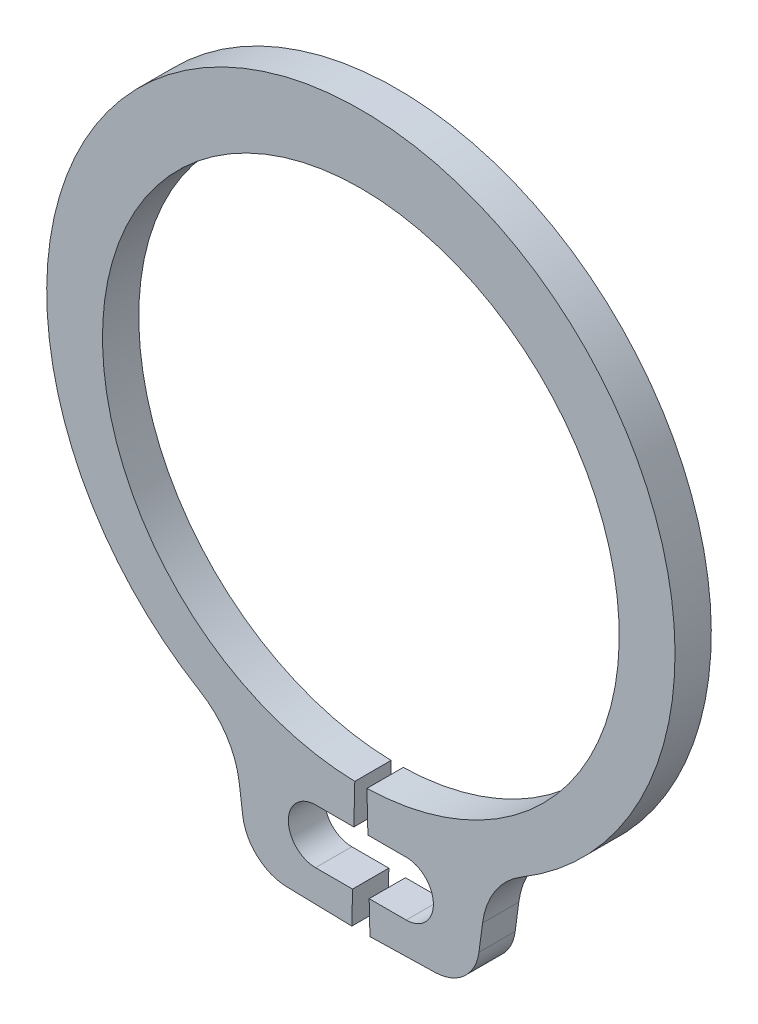
ISO-10303-21;
HEADER;
FILE_DESCRIPTION(('STEP AP214'),'2;1');
FILE_NAME('part.step','',(''),(''),'','','');
FILE_SCHEMA(('AUTOMOTIVE_DESIGN { 1 0 10303 214 1 1 1 1 }'));
ENDSEC;
DATA;
#1=APPLICATION_CONTEXT('core data for automotive mechanical design processes');
#2=APPLICATION_PROTOCOL_DEFINITION('international standard','automotive_design',2000,#1);
#3=PRODUCT_CONTEXT('',#1,'mechanical');
#4=PRODUCT('Part','Part','',(#3));
#5=PRODUCT_RELATED_PRODUCT_CATEGORY('part','',(#4));
#6=PRODUCT_DEFINITION_FORMATION('','',#4);
#7=PRODUCT_DEFINITION_CONTEXT('part definition',#1,'design');
#8=PRODUCT_DEFINITION('design','',#6,#7);
#9=PRODUCT_DEFINITION_SHAPE('','',#8);
#10=(LENGTH_UNIT() NAMED_UNIT(*) SI_UNIT(.MILLI.,.METRE.));
#11=(NAMED_UNIT(*) PLANE_ANGLE_UNIT() SI_UNIT($,.RADIAN.));
#12=(NAMED_UNIT(*) SI_UNIT($,.STERADIAN.) SOLID_ANGLE_UNIT());
#13=UNCERTAINTY_MEASURE_WITH_UNIT(LENGTH_MEASURE(1.E-05),#10,'distance_accuracy_value','');
#14=(GEOMETRIC_REPRESENTATION_CONTEXT(3) GLOBAL_UNCERTAINTY_ASSIGNED_CONTEXT((#13)) GLOBAL_UNIT_ASSIGNED_CONTEXT((#10,
#11,#12)) REPRESENTATION_CONTEXT('',''));
#15=CARTESIAN_POINT('',(0.,0.,0.));
#16=DIRECTION('',(0.,0.,1.));
#17=DIRECTION('',(1.,0.,0.));
#18=AXIS2_PLACEMENT_3D('',#15,#16,#17);
#19=CARTESIAN_POINT('',(0.,0.,0.));
#20=DIRECTION('',(0.,0.,1.));
#21=DIRECTION('',(1.,0.,0.));
#22=AXIS2_PLACEMENT_3D('',#19,#20,#21);
#23=PLANE('',#22);
#24=CARTESIAN_POINT('',(0.,0.,0.));
#25=DIRECTION('',(0.,0.,1.));
#26=DIRECTION('',(1.,0.,0.));
#27=AXIS2_PLACEMENT_3D('',#24,#25,#26);
#28=CIRCLE('',#27,2.85);
#29=CARTESIAN_POINT('',(-0.0670588235294138,-2.84921096344003,0.));
#30=VERTEX_POINT('',#29);
#31=CARTESIAN_POINT('',(0.0670588235294131,-2.84921096344003,0.));
#32=VERTEX_POINT('',#31);
#33=EDGE_CURVE('E169',#30,#32,#28,.F.);
#34=ORIENTED_EDGE('',*,*,#33,.T.);
#35=DIRECTION('',(0.0235294117647061,-0.999723145066676,0.));
#36=VECTOR('',#35,1.);
#37=CARTESIAN_POINT('',(0.0670588235294131,-2.84921096344003,0.));
#38=LINE('',#37,#36);
#39=CARTESIAN_POINT('',(0.0774414789751765,-3.29035165408627,0.));
#40=VERTEX_POINT('',#39);
#41=EDGE_CURVE('E145',#32,#40,#38,.T.);
#42=ORIENTED_EDGE('',*,*,#41,.T.);
#43=DIRECTION('',(1.,0.,0.));
#44=VECTOR('',#43,1.);
#45=CARTESIAN_POINT('',(0.,-3.29035165408627,0.));
#46=LINE('',#45,#44);
#47=CARTESIAN_POINT('',(0.5,-3.29035165408627,0.));
#48=VERTEX_POINT('',#47);
#49=EDGE_CURVE('E150',#40,#48,#46,.T.);
#50=ORIENTED_EDGE('',*,*,#49,.T.);
#51=CARTESIAN_POINT('',(0.5,-3.59035165408627,0.));
#52=DIRECTION('',(0.,0.,1.));
#53=DIRECTION('',(1.,0.,0.));
#54=AXIS2_PLACEMENT_3D('',#51,#52,#53);
#55=CIRCLE('',#54,0.3);
#56=CARTESIAN_POINT('',(0.499999999999987,-3.89035165408627,0.));
#57=VERTEX_POINT('',#56);
#58=EDGE_CURVE('E19',#48,#57,#55,.F.);
#59=ORIENTED_EDGE('',*,*,#58,.T.);
#60=DIRECTION('',(1.,0.,0.));
#61=VECTOR('',#60,1.);
#62=CARTESIAN_POINT('',(0.499999999999973,-3.89035165408627,0.));
#63=LINE('',#62,#61);
#64=CARTESIAN_POINT('',(0.0915630356566403,-3.89035165408627,0.));
#65=VERTEX_POINT('',#64);
#66=EDGE_CURVE('E244',#57,#65,#63,.F.);
#67=ORIENTED_EDGE('',*,*,#66,.T.);
#68=DIRECTION('',(0.0235294117647059,-0.999723145066676,0.));
#69=VECTOR('',#68,1.);
#70=CARTESIAN_POINT('',(0.0670588235294131,-2.84921096344003,0.));
#71=LINE('',#70,#69);
#72=CARTESIAN_POINT('',(0.100000000000002,-4.24882336653338,0.));
#73=VERTEX_POINT('',#72);
#74=EDGE_CURVE('E243',#73,#65,#71,.F.);
#75=ORIENTED_EDGE('',*,*,#74,.F.);
#76=DIRECTION('',(0.999723145066676,0.0235294117647064,0.));
#77=VECTOR('',#76,1.);
#78=CARTESIAN_POINT('',(0.100000000000003,-4.24882336653338,0.));
#79=LINE('',#78,#77);
#80=CARTESIAN_POINT('',(0.818532180224087,-4.2319120450159,0.));
#81=VERTEX_POINT('',#80);
#82=EDGE_CURVE('E234',#81,#73,#79,.F.);
#83=ORIENTED_EDGE('',*,*,#82,.F.);
#84=CARTESIAN_POINT('',(0.806767474341746,-3.73205047248256,0.));
#85=DIRECTION('',(0.,0.,1.));
#86=DIRECTION('',(1.,0.,0.));
#87=AXIS2_PLACEMENT_3D('',#84,#85,#86);
#88=CIRCLE('',#87,0.499999999999999);
#89=CARTESIAN_POINT('',(1.30248990502863,-3.79731356859259,0.));
#90=VERTEX_POINT('',#89);
#91=EDGE_CURVE('E231',#90,#81,#88,.F.);
#92=ORIENTED_EDGE('',*,*,#91,.F.);
#93=DIRECTION('',(0.130526192220054,0.99144486137381,0.));
#94=VECTOR('',#93,1.);
#95=CARTESIAN_POINT('',(1.34189484626025,-3.49800332417078,0.));
#96=LINE('',#95,#94);
#97=CARTESIAN_POINT('',(1.34189484626025,-3.49800332417078,0.));
#98=VERTEX_POINT('',#97);
#99=EDGE_CURVE('E228',#98,#90,#96,.F.);
#100=ORIENTED_EDGE('',*,*,#99,.F.);
#101=CARTESIAN_POINT('',(2.23404735245542,-3.61545742984023,0.));
#102=DIRECTION('',(0.,0.,1.));
#103=DIRECTION('',(1.,0.,0.));
#104=AXIS2_PLACEMENT_3D('',#101,#102,#103);
#105=CIRCLE('',#104,0.899850855002616);
#106=CARTESIAN_POINT('',(1.77351197353993,-2.84238645896103,0.));
#107=VERTEX_POINT('',#106);
#108=EDGE_CURVE('E222',#98,#107,#105,.F.);
#109=ORIENTED_EDGE('',*,*,#108,.T.);
#110=CARTESIAN_POINT('',(0.,0.134693448513281,0.));
#111=DIRECTION('',(0.,0.,1.));
#112=DIRECTION('',(1.,0.,0.));
#113=AXIS2_PLACEMENT_3D('',#110,#111,#112);
#114=CIRCLE('',#113,3.46530655148672);
#115=CARTESIAN_POINT('',(-1.77351197353993,-2.84238645896103,0.));
#116=VERTEX_POINT('',#115);
#117=EDGE_CURVE('E219',#116,#107,#114,.F.);
#118=ORIENTED_EDGE('',*,*,#117,.F.);
#119=CARTESIAN_POINT('',(-2.23404735245541,-3.61545742984023,0.));
#120=DIRECTION('',(0.,0.,1.));
#121=DIRECTION('',(1.,0.,0.));
#122=AXIS2_PLACEMENT_3D('',#119,#120,#121);
#123=CIRCLE('',#122,0.899850855002616);
#124=CARTESIAN_POINT('',(-1.3418948462602,-3.49800332417078,0.));
#125=VERTEX_POINT('',#124);
#126=EDGE_CURVE('E218',#116,#125,#123,.F.);
#127=ORIENTED_EDGE('',*,*,#126,.T.);
#128=DIRECTION('',(0.130526192220054,-0.99144486137381,0.));
#129=VECTOR('',#128,1.);
#130=CARTESIAN_POINT('',(-1.3418948462602,-3.49800332417078,0.));
#131=LINE('',#130,#129);
#132=CARTESIAN_POINT('',(-1.3024899050286,-3.79731356859259,0.));
#133=VERTEX_POINT('',#132);
#134=EDGE_CURVE('E214',#133,#125,#131,.F.);
#135=ORIENTED_EDGE('',*,*,#134,.F.);
#136=CARTESIAN_POINT('',(-0.806767474341718,-3.73205047248256,0.));
#137=DIRECTION('',(0.,0.,1.));
#138=DIRECTION('',(1.,0.,0.));
#139=AXIS2_PLACEMENT_3D('',#136,#137,#138);
#140=CIRCLE('',#139,0.499999999999999);
#141=CARTESIAN_POINT('',(-0.818532180224074,-4.2319120450159,0.));
#142=VERTEX_POINT('',#141);
#143=EDGE_CURVE('E211',#142,#133,#140,.F.);
#144=ORIENTED_EDGE('',*,*,#143,.F.);
#145=DIRECTION('',(0.999723145066676,-0.0235294117647064,0.));
#146=VECTOR('',#145,1.);
#147=CARTESIAN_POINT('',(-0.100000000000003,-4.24882336653338,0.));
#148=LINE('',#147,#146);
#149=CARTESIAN_POINT('',(-0.100000000000001,-4.24882336653338,0.));
#150=VERTEX_POINT('',#149);
#151=EDGE_CURVE('E208',#150,#142,#148,.F.);
#152=ORIENTED_EDGE('',*,*,#151,.F.);
#153=DIRECTION('',(0.0235294117647059,0.999723145066676,0.));
#154=VECTOR('',#153,1.);
#155=CARTESIAN_POINT('',(-0.0670588235294131,-2.84921096344003,0.));
#156=LINE('',#155,#154);
#157=CARTESIAN_POINT('',(-0.0915630356566333,-3.89035165408627,0.));
#158=VERTEX_POINT('',#157);
#159=EDGE_CURVE('E203',#158,#150,#156,.F.);
#160=ORIENTED_EDGE('',*,*,#159,.F.);
#161=DIRECTION('',(1.,0.,0.));
#162=VECTOR('',#161,1.);
#163=CARTESIAN_POINT('',(0.499999999999973,-3.89035165408627,0.));
#164=LINE('',#163,#162);
#165=CARTESIAN_POINT('',(-0.5,-3.89035165408627,0.));
#166=VERTEX_POINT('',#165);
#167=EDGE_CURVE('E190',#158,#166,#164,.F.);
#168=ORIENTED_EDGE('',*,*,#167,.T.);
#169=CARTESIAN_POINT('',(-0.5,-3.59035165408627,0.));
#170=DIRECTION('',(0.,0.,1.));
#171=DIRECTION('',(1.,0.,0.));
#172=AXIS2_PLACEMENT_3D('',#169,#170,#171);
#173=CIRCLE('',#172,0.3);
#174=CARTESIAN_POINT('',(-0.5,-3.29035165408627,0.));
#175=VERTEX_POINT('',#174);
#176=EDGE_CURVE('E183',#166,#175,#173,.F.);
#177=ORIENTED_EDGE('',*,*,#176,.T.);
#178=DIRECTION('',(-1.,0.,0.));
#179=VECTOR('',#178,1.);
#180=CARTESIAN_POINT('',(-0.5,-3.29035165408627,0.));
#181=LINE('',#180,#179);
#182=CARTESIAN_POINT('',(-0.0774414789751764,-3.29035165408627,0.));
#183=VERTEX_POINT('',#182);
#184=EDGE_CURVE('E177',#175,#183,#181,.F.);
#185=ORIENTED_EDGE('',*,*,#184,.T.);
#186=DIRECTION('',(0.0235294117647059,0.999723145066676,0.));
#187=VECTOR('',#186,1.);
#188=CARTESIAN_POINT('',(-0.0670588235294131,-2.84921096344003,0.));
#189=LINE('',#188,#187);
#190=EDGE_CURVE('E173',#30,#183,#189,.F.);
#191=ORIENTED_EDGE('',*,*,#190,.F.);
#192=EDGE_LOOP('',(#34,#42,#50,#59,#67,#75,#83,#92,#100,#109,#118,#127,#135,#144,#152,#160,#168,
#177,#185,#191));
#193=FACE_BOUND('',#192,.T.);
#194=ADVANCED_FACE('F16',(#193),#23,.T.);
#195=CARTESIAN_POINT('',(0.499999999999973,-3.89035165408627,-0.400000000000001));
#196=DIRECTION('',(0.,-1.,0.));
#197=DIRECTION('',(1.,0.,0.));
#198=AXIS2_PLACEMENT_3D('',#195,#196,#197);
#199=PLANE('',#198);
#200=ORIENTED_EDGE('',*,*,#66,.F.);
#201=DIRECTION('',(0.,0.,1.));
#202=VECTOR('',#201,1.);
#203=CARTESIAN_POINT('',(0.499999999999973,-3.89035165408627,-0.400000000000001));
#204=LINE('',#203,#202);
#205=CARTESIAN_POINT('',(0.499999999999987,-3.89035165408627,-0.400000000000001));
#206=VERTEX_POINT('',#205);
#207=EDGE_CURVE('E149',#57,#206,#204,.F.);
#208=ORIENTED_EDGE('',*,*,#207,.T.);
#209=DIRECTION('',(1.,0.,0.));
#210=VECTOR('',#209,1.);
#211=CARTESIAN_POINT('',(0.,-3.89035165408627,-0.400000000000001));
#212=LINE('',#211,#210);
#213=CARTESIAN_POINT('',(0.0915630356566472,-3.89035165408627,-0.400000000000001));
#214=VERTEX_POINT('',#213);
#215=EDGE_CURVE('E159',#206,#214,#212,.F.);
#216=ORIENTED_EDGE('',*,*,#215,.T.);
#217=DIRECTION('',(0.,0.,1.));
#218=VECTOR('',#217,1.);
#219=CARTESIAN_POINT('',(0.0915630356566334,-3.89035165408627,-0.400000000000001));
#220=LINE('',#219,#218);
#221=EDGE_CURVE('E135',#65,#214,#220,.F.);
#222=ORIENTED_EDGE('',*,*,#221,.F.);
#223=EDGE_LOOP('',(#200,#208,#216,#222));
#224=FACE_BOUND('',#223,.T.);
#225=ADVANCED_FACE('F336',(#224),#199,.F.);
#226=CARTESIAN_POINT('',(0.0670588235294131,-2.84921096344003,-0.400000000000001));
#227=DIRECTION('',(-0.999723145066676,-0.0235294117647059,0.));
#228=DIRECTION('',(0.0235294117647059,-0.999723145066676,0.));
#229=AXIS2_PLACEMENT_3D('',#226,#227,#228);
#230=PLANE('',#229);
#231=DIRECTION('',(0.,0.,1.));
#232=VECTOR('',#231,1.);
#233=CARTESIAN_POINT('',(0.100000000000003,-4.24882336653338,-0.400000000000001));
#234=LINE('',#233,#232);
#235=CARTESIAN_POINT('',(0.100000000000003,-4.24882336653338,-0.400000000000001));
#236=VERTEX_POINT('',#235);
#237=EDGE_CURVE('E232',#73,#236,#234,.F.);
#238=ORIENTED_EDGE('',*,*,#237,.F.);
#239=ORIENTED_EDGE('',*,*,#74,.T.);
#240=ORIENTED_EDGE('',*,*,#221,.T.);
#241=DIRECTION('',(0.0235294117646524,-0.999723145066678,0.));
#242=VECTOR('',#241,1.);
#243=CARTESIAN_POINT('',(0.0915630356566541,-3.89035165408627,-0.400000000000001));
#244=LINE('',#243,#242);
#245=EDGE_CURVE('E237',#214,#236,#244,.T.);
#246=ORIENTED_EDGE('',*,*,#245,.T.);
#247=EDGE_LOOP('',(#238,#239,#240,#246));
#248=FACE_BOUND('',#247,.T.);
#249=ADVANCED_FACE('F338',(#248),#230,.T.);
#250=CARTESIAN_POINT('',(0.100000000000003,-4.24882336653338,-0.400000000000001));
#251=DIRECTION('',(0.0235294117647064,-0.999723145066676,0.));
#252=DIRECTION('',(0.999723145066676,0.0235294117647064,0.));
#253=AXIS2_PLACEMENT_3D('',#250,#251,#252);
#254=PLANE('',#253);
#255=DIRECTION('',(0.999723145066676,0.0235294117647099,0.));
#256=VECTOR('',#255,1.);
#257=CARTESIAN_POINT('',(0.100000000000003,-4.24882336653338,-0.400000000000001));
#258=LINE('',#257,#256);
#259=CARTESIAN_POINT('',(0.818532180224088,-4.2319120450159,-0.400000000000001));
#260=VERTEX_POINT('',#259);
#261=EDGE_CURVE('E239',#236,#260,#258,.T.);
#262=ORIENTED_EDGE('',*,*,#261,.T.);
#263=DIRECTION('',(0.,0.,1.));
#264=VECTOR('',#263,1.);
#265=CARTESIAN_POINT('',(0.818532180224076,-4.2319120450159,-0.400000000000001));
#266=LINE('',#265,#264);
#267=EDGE_CURVE('E229',#81,#260,#266,.F.);
#268=ORIENTED_EDGE('',*,*,#267,.F.);
#269=ORIENTED_EDGE('',*,*,#82,.T.);
#270=ORIENTED_EDGE('',*,*,#237,.T.);
#271=EDGE_LOOP('',(#262,#268,#269,#270));
#272=FACE_BOUND('',#271,.T.);
#273=ADVANCED_FACE('F324',(#272),#254,.T.);
#274=CARTESIAN_POINT('',(0.806767474341746,-3.73205047248256,-0.400000000000001));
#275=DIRECTION('',(0.,0.,1.));
#276=DIRECTION('',(1.,0.,0.));
#277=AXIS2_PLACEMENT_3D('',#274,#275,#276);
#278=CYLINDRICAL_SURFACE('',#277,0.499999999999999);
#279=CARTESIAN_POINT('',(0.806767474341746,-3.73205047248256,-0.400000000000001));
#280=DIRECTION('',(0.,0.,1.));
#281=DIRECTION('',(1.,0.,0.));
#282=AXIS2_PLACEMENT_3D('',#279,#280,#281);
#283=CIRCLE('',#282,0.499999999999999);
#284=CARTESIAN_POINT('',(1.30248990502864,-3.79731356859257,-0.400000000000001));
#285=VERTEX_POINT('',#284);
#286=EDGE_CURVE('E303',#260,#285,#283,.T.);
#287=ORIENTED_EDGE('',*,*,#286,.T.);
#288=DIRECTION('',(0.,0.,1.));
#289=VECTOR('',#288,1.);
#290=CARTESIAN_POINT('',(1.30248990502863,-3.79731356859258,-0.400000000000001));
#291=LINE('',#290,#289);
#292=EDGE_CURVE('E226',#90,#285,#291,.F.);
#293=ORIENTED_EDGE('',*,*,#292,.F.);
#294=ORIENTED_EDGE('',*,*,#91,.T.);
#295=ORIENTED_EDGE('',*,*,#267,.T.);
#296=EDGE_LOOP('',(#287,#293,#294,#295));
#297=FACE_BOUND('',#296,.T.);
#298=ADVANCED_FACE('F317',(#297),#278,.T.);
#299=CARTESIAN_POINT('',(1.34189484626025,-3.49800332417078,-0.400000000000001));
#300=DIRECTION('',(0.99144486137381,-0.130526192220054,0.));
#301=DIRECTION('',(0.130526192220054,0.99144486137381,0.));
#302=AXIS2_PLACEMENT_3D('',#299,#300,#301);
#303=PLANE('',#302);
#304=DIRECTION('',(0.130526192219968,0.991444861373821,0.));
#305=VECTOR('',#304,1.);
#306=CARTESIAN_POINT('',(1.30248990502865,-3.79731356859259,-0.400000000000001));
#307=LINE('',#306,#305);
#308=CARTESIAN_POINT('',(1.34189484626025,-3.49800332417082,-0.400000000000001));
#309=VERTEX_POINT('',#308);
#310=EDGE_CURVE('E302',#285,#309,#307,.T.);
#311=ORIENTED_EDGE('',*,*,#310,.T.);
#312=DIRECTION('',(0.,0.,1.));
#313=VECTOR('',#312,1.);
#314=CARTESIAN_POINT('',(1.34189484626025,-3.49800332417078,-0.400000000000001));
#315=LINE('',#314,#313);
#316=EDGE_CURVE('E223',#309,#98,#315,.T.);
#317=ORIENTED_EDGE('',*,*,#316,.T.);
#318=ORIENTED_EDGE('',*,*,#99,.T.);
#319=ORIENTED_EDGE('',*,*,#292,.T.);
#320=EDGE_LOOP('',(#311,#317,#318,#319));
#321=FACE_BOUND('',#320,.T.);
#322=ADVANCED_FACE('F407',(#321),#303,.T.);
#323=CARTESIAN_POINT('',(2.23404735245542,-3.61545742984023,-0.400000000000001));
#324=DIRECTION('',(0.,0.,1.));
#325=DIRECTION('',(1.,0.,0.));
#326=AXIS2_PLACEMENT_3D('',#323,#324,#325);
#327=CYLINDRICAL_SURFACE('',#326,0.899850855002616);
#328=ORIENTED_EDGE('',*,*,#316,.F.);
#329=CARTESIAN_POINT('',(2.23404735245542,-3.61545742984023,-0.400000000000001));
#330=DIRECTION('',(0.,0.,1.));
#331=DIRECTION('',(1.,0.,0.));
#332=AXIS2_PLACEMENT_3D('',#329,#330,#331);
#333=CIRCLE('',#332,0.899850855002616);
#334=CARTESIAN_POINT('',(1.77351197353993,-2.84238645896103,-0.400000000000001));
#335=VERTEX_POINT('',#334);
#336=EDGE_CURVE('E299',#309,#335,#333,.F.);
#337=ORIENTED_EDGE('',*,*,#336,.T.);
#338=DIRECTION('',(0.,0.,1.));
#339=VECTOR('',#338,1.);
#340=CARTESIAN_POINT('',(1.77351197353993,-2.84238645896104,-0.400000000000001));
#341=LINE('',#340,#339);
#342=EDGE_CURVE('E220',#107,#335,#341,.F.);
#343=ORIENTED_EDGE('',*,*,#342,.F.);
#344=ORIENTED_EDGE('',*,*,#108,.F.);
#345=EDGE_LOOP('',(#328,#337,#343,#344));
#346=FACE_BOUND('',#345,.T.);
#347=ADVANCED_FACE('F403',(#346),#327,.F.);
#348=CARTESIAN_POINT('',(0.,0.134693448513281,-0.400000000000001));
#349=DIRECTION('',(0.,0.,1.));
#350=DIRECTION('',(1.,0.,0.));
#351=AXIS2_PLACEMENT_3D('',#348,#349,#350);
#352=CYLINDRICAL_SURFACE('',#351,3.46530655148672);
#353=DIRECTION('',(0.,0.,1.));
#354=VECTOR('',#353,1.);
#355=CARTESIAN_POINT('',(-1.77351197353993,-2.84238645896103,-0.400000000000001));
#356=LINE('',#355,#354);
#357=CARTESIAN_POINT('',(-1.77351197353993,-2.84238645896103,-0.400000000000001));
#358=VERTEX_POINT('',#357);
#359=EDGE_CURVE('E215',#358,#116,#356,.T.);
#360=ORIENTED_EDGE('',*,*,#359,.T.);
#361=ORIENTED_EDGE('',*,*,#117,.T.);
#362=ORIENTED_EDGE('',*,*,#342,.T.);
#363=CARTESIAN_POINT('',(0.,0.134693448513281,-0.400000000000001));
#364=DIRECTION('',(0.,0.,1.));
#365=DIRECTION('',(1.,0.,0.));
#366=AXIS2_PLACEMENT_3D('',#363,#364,#365);
#367=CIRCLE('',#366,3.46530655148672);
#368=EDGE_CURVE('E297',#335,#358,#367,.T.);
#369=ORIENTED_EDGE('',*,*,#368,.T.);
#370=EDGE_LOOP('',(#360,#361,#362,#369));
#371=FACE_BOUND('',#370,.T.);
#372=ADVANCED_FACE('F399',(#371),#352,.T.);
#373=CARTESIAN_POINT('',(-2.23404735245541,-3.61545742984023,-0.400000000000001));
#374=DIRECTION('',(0.,0.,1.));
#375=DIRECTION('',(1.,0.,0.));
#376=AXIS2_PLACEMENT_3D('',#373,#374,#375);
#377=CYLINDRICAL_SURFACE('',#376,0.899850855002616);
#378=ORIENTED_EDGE('',*,*,#359,.F.);
#379=CARTESIAN_POINT('',(-2.23404735245541,-3.61545742984023,-0.400000000000001));
#380=DIRECTION('',(0.,0.,1.));
#381=DIRECTION('',(1.,0.,0.));
#382=AXIS2_PLACEMENT_3D('',#379,#380,#381);
#383=CIRCLE('',#382,0.899850855002616);
#384=CARTESIAN_POINT('',(-1.3418948462602,-3.49800332417077,-0.400000000000001));
#385=VERTEX_POINT('',#384);
#386=EDGE_CURVE('E294',#358,#385,#383,.F.);
#387=ORIENTED_EDGE('',*,*,#386,.T.);
#388=DIRECTION('',(0.,0.,1.));
#389=VECTOR('',#388,1.);
#390=CARTESIAN_POINT('',(-1.3418948462602,-3.49800332417078,-0.400000000000001));
#391=LINE('',#390,#389);
#392=EDGE_CURVE('E212',#125,#385,#391,.F.);
#393=ORIENTED_EDGE('',*,*,#392,.F.);
#394=ORIENTED_EDGE('',*,*,#126,.F.);
#395=EDGE_LOOP('',(#378,#387,#393,#394));
#396=FACE_BOUND('',#395,.T.);
#397=ADVANCED_FACE('F395',(#396),#377,.F.);
#398=CARTESIAN_POINT('',(-1.3418948462602,-3.49800332417078,-0.400000000000001));
#399=DIRECTION('',(-0.99144486137381,-0.130526192220054,0.));
#400=DIRECTION('',(0.130526192220054,-0.99144486137381,0.));
#401=AXIS2_PLACEMENT_3D('',#398,#399,#400);
#402=PLANE('',#401);
#403=DIRECTION('',(0.130526192220058,-0.991444861373809,0.));
#404=VECTOR('',#403,1.);
#405=CARTESIAN_POINT('',(-1.3418948462602,-3.49800332417078,-0.400000000000001));
#406=LINE('',#405,#404);
#407=CARTESIAN_POINT('',(-1.3024899050286,-3.79731356859259,-0.400000000000001));
#408=VERTEX_POINT('',#407);
#409=EDGE_CURVE('E293',#385,#408,#406,.T.);
#410=ORIENTED_EDGE('',*,*,#409,.T.);
#411=DIRECTION('',(0.,0.,1.));
#412=VECTOR('',#411,1.);
#413=CARTESIAN_POINT('',(-1.30248990502862,-3.7973135685926,-0.400000000000001));
#414=LINE('',#413,#412);
#415=EDGE_CURVE('E209',#133,#408,#414,.F.);
#416=ORIENTED_EDGE('',*,*,#415,.F.);
#417=ORIENTED_EDGE('',*,*,#134,.T.);
#418=ORIENTED_EDGE('',*,*,#392,.T.);
#419=EDGE_LOOP('',(#410,#416,#417,#418));
#420=FACE_BOUND('',#419,.T.);
#421=ADVANCED_FACE('F391',(#420),#402,.T.);
#422=CARTESIAN_POINT('',(-0.806767474341718,-3.73205047248256,-0.400000000000001));
#423=DIRECTION('',(0.,0.,1.));
#424=DIRECTION('',(1.,0.,0.));
#425=AXIS2_PLACEMENT_3D('',#422,#423,#424);
#426=CYLINDRICAL_SURFACE('',#425,0.499999999999999);
#427=CARTESIAN_POINT('',(-0.806767474341718,-3.73205047248256,-0.400000000000001));
#428=DIRECTION('',(0.,0.,1.));
#429=DIRECTION('',(1.,0.,0.));
#430=AXIS2_PLACEMENT_3D('',#427,#428,#429);
#431=CIRCLE('',#430,0.499999999999999);
#432=CARTESIAN_POINT('',(-0.818532180224074,-4.2319120450159,-0.400000000000001));
#433=VERTEX_POINT('',#432);
#434=EDGE_CURVE('E290',#408,#433,#431,.T.);
#435=ORIENTED_EDGE('',*,*,#434,.T.);
#436=DIRECTION('',(0.,0.,1.));
#437=VECTOR('',#436,1.);
#438=CARTESIAN_POINT('',(-0.818532180224075,-4.2319120450159,-0.400000000000001));
#439=LINE('',#438,#437);
#440=EDGE_CURVE('E206',#142,#433,#439,.F.);
#441=ORIENTED_EDGE('',*,*,#440,.F.);
#442=ORIENTED_EDGE('',*,*,#143,.T.);
#443=ORIENTED_EDGE('',*,*,#415,.T.);
#444=EDGE_LOOP('',(#435,#441,#442,#443));
#445=FACE_BOUND('',#444,.T.);
#446=ADVANCED_FACE('F387',(#445),#426,.T.);
#447=CARTESIAN_POINT('',(-0.100000000000003,-4.24882336653338,-0.400000000000001));
#448=DIRECTION('',(-0.0235294117647064,-0.999723145066676,0.));
#449=DIRECTION('',(0.999723145066676,-0.0235294117647064,0.));
#450=AXIS2_PLACEMENT_3D('',#447,#448,#449);
#451=PLANE('',#450);
#452=DIRECTION('',(0.999723145066676,-0.0235294117647075,0.));
#453=VECTOR('',#452,1.);
#454=CARTESIAN_POINT('',(-0.818532180224075,-4.2319120450159,-0.400000000000001));
#455=LINE('',#454,#453);
#456=CARTESIAN_POINT('',(-0.100000000000002,-4.24882336653338,-0.400000000000001));
#457=VERTEX_POINT('',#456);
#458=EDGE_CURVE('E197',#433,#457,#455,.T.);
#459=ORIENTED_EDGE('',*,*,#458,.T.);
#460=DIRECTION('',(0.,0.,1.));
#461=VECTOR('',#460,1.);
#462=CARTESIAN_POINT('',(-0.100000000000001,-4.24882336653338,-0.400000000000001));
#463=LINE('',#462,#461);
#464=EDGE_CURVE('E200',#150,#457,#463,.F.);
#465=ORIENTED_EDGE('',*,*,#464,.F.);
#466=ORIENTED_EDGE('',*,*,#151,.T.);
#467=ORIENTED_EDGE('',*,*,#440,.T.);
#468=EDGE_LOOP('',(#459,#465,#466,#467));
#469=FACE_BOUND('',#468,.T.);
#470=ADVANCED_FACE('F383',(#469),#451,.T.);
#471=CARTESIAN_POINT('',(-0.0670588235294131,-2.84921096344003,-0.400000000000001));
#472=DIRECTION('',(0.999723145066676,-0.0235294117647059,0.));
#473=DIRECTION('',(0.0235294117647059,0.999723145066676,0.));
#474=AXIS2_PLACEMENT_3D('',#471,#472,#473);
#475=PLANE('',#474);
#476=ORIENTED_EDGE('',*,*,#464,.T.);
#477=DIRECTION('',(0.0235294117647104,0.999723145066676,0.));
#478=VECTOR('',#477,1.);
#479=CARTESIAN_POINT('',(-0.100000000000003,-4.24882336653338,-0.400000000000001));
#480=LINE('',#479,#478);
#481=CARTESIAN_POINT('',(-0.0915630356566333,-3.89035165408627,-0.400000000000001));
#482=VERTEX_POINT('',#481);
#483=EDGE_CURVE('E193',#457,#482,#480,.T.);
#484=ORIENTED_EDGE('',*,*,#483,.T.);
#485=DIRECTION('',(0.,0.,1.));
#486=VECTOR('',#485,1.);
#487=CARTESIAN_POINT('',(-0.0915630356566333,-3.89035165408627,-0.400000000000001));
#488=LINE('',#487,#486);
#489=EDGE_CURVE('E187',#482,#158,#488,.T.);
#490=ORIENTED_EDGE('',*,*,#489,.T.);
#491=ORIENTED_EDGE('',*,*,#159,.T.);
#492=EDGE_LOOP('',(#476,#484,#490,#491));
#493=FACE_BOUND('',#492,.T.);
#494=ADVANCED_FACE('F379',(#493),#475,.T.);
#495=CARTESIAN_POINT('',(0.499999999999973,-3.89035165408627,-0.400000000000001));
#496=DIRECTION('',(0.,-1.,0.));
#497=DIRECTION('',(1.,0.,0.));
#498=AXIS2_PLACEMENT_3D('',#495,#496,#497);
#499=PLANE('',#498);
#500=DIRECTION('',(1.,0.,0.));
#501=VECTOR('',#500,1.);
#502=CARTESIAN_POINT('',(0.,-3.89035165408627,-0.400000000000001));
#503=LINE('',#502,#501);
#504=CARTESIAN_POINT('',(-0.5,-3.89035165408627,-0.400000000000001));
#505=VERTEX_POINT('',#504);
#506=EDGE_CURVE('E196',#482,#505,#503,.F.);
#507=ORIENTED_EDGE('',*,*,#506,.T.);
#508=DIRECTION('',(0.,0.,1.));
#509=VECTOR('',#508,1.);
#510=CARTESIAN_POINT('',(-0.500000000000001,-3.89035165408627,-0.400000000000001));
#511=LINE('',#510,#509);
#512=EDGE_CURVE('E184',#505,#166,#511,.T.);
#513=ORIENTED_EDGE('',*,*,#512,.T.);
#514=ORIENTED_EDGE('',*,*,#167,.F.);
#515=ORIENTED_EDGE('',*,*,#489,.F.);
#516=EDGE_LOOP('',(#507,#513,#514,#515));
#517=FACE_BOUND('',#516,.T.);
#518=ADVANCED_FACE('F375',(#517),#499,.F.);
#519=CARTESIAN_POINT('',(-0.5,-3.59035165408627,-0.400000000000001));
#520=DIRECTION('',(0.,0.,1.));
#521=DIRECTION('',(1.,0.,0.));
#522=AXIS2_PLACEMENT_3D('',#519,#520,#521);
#523=CYLINDRICAL_SURFACE('',#522,0.3);
#524=ORIENTED_EDGE('',*,*,#512,.F.);
#525=CARTESIAN_POINT('',(-0.5,-3.59035165408627,-0.400000000000001));
#526=DIRECTION('',(0.,0.,1.));
#527=DIRECTION('',(1.,0.,0.));
#528=AXIS2_PLACEMENT_3D('',#525,#526,#527);
#529=CIRCLE('',#528,0.3);
#530=CARTESIAN_POINT('',(-0.5,-3.29035165408627,-0.400000000000001));
#531=VERTEX_POINT('',#530);
#532=EDGE_CURVE('E286',#505,#531,#529,.F.);
#533=ORIENTED_EDGE('',*,*,#532,.T.);
#534=DIRECTION('',(0.,0.,1.));
#535=VECTOR('',#534,1.);
#536=CARTESIAN_POINT('',(-0.5,-3.29035165408627,-0.400000000000001));
#537=LINE('',#536,#535);
#538=EDGE_CURVE('E180',#531,#175,#537,.T.);
#539=ORIENTED_EDGE('',*,*,#538,.T.);
#540=ORIENTED_EDGE('',*,*,#176,.F.);
#541=EDGE_LOOP('',(#524,#533,#539,#540));
#542=FACE_BOUND('',#541,.T.);
#543=ADVANCED_FACE('F371',(#542),#523,.F.);
#544=CARTESIAN_POINT('',(-0.5,-3.29035165408627,-0.400000000000001));
#545=DIRECTION('',(0.,1.,0.));
#546=DIRECTION('',(-1.,0.,0.));
#547=AXIS2_PLACEMENT_3D('',#544,#545,#546);
#548=PLANE('',#547);
#549=ORIENTED_EDGE('',*,*,#184,.F.);
#550=ORIENTED_EDGE('',*,*,#538,.F.);
#551=DIRECTION('',(1.,0.,0.));
#552=VECTOR('',#551,1.);
#553=CARTESIAN_POINT('',(0.,-3.29035165408627,-0.400000000000001));
#554=LINE('',#553,#552);
#555=CARTESIAN_POINT('',(-0.0774414789751765,-3.29035165408627,-0.400000000000001));
#556=VERTEX_POINT('',#555);
#557=EDGE_CURVE('E289',#531,#556,#554,.T.);
#558=ORIENTED_EDGE('',*,*,#557,.T.);
#559=DIRECTION('',(0.,0.,1.));
#560=VECTOR('',#559,1.);
#561=CARTESIAN_POINT('',(-0.0774414789751764,-3.29035165408627,-0.400000000000001));
#562=LINE('',#561,#560);
#563=EDGE_CURVE('E174',#183,#556,#562,.F.);
#564=ORIENTED_EDGE('',*,*,#563,.F.);
#565=EDGE_LOOP('',(#549,#550,#558,#564));
#566=FACE_BOUND('',#565,.T.);
#567=ADVANCED_FACE('F367',(#566),#548,.F.);
#568=CARTESIAN_POINT('',(-0.0670588235294131,-2.84921096344003,-0.400000000000001));
#569=DIRECTION('',(0.999723145066676,-0.0235294117647059,0.));
#570=DIRECTION('',(0.0235294117647059,0.999723145066676,0.));
#571=AXIS2_PLACEMENT_3D('',#568,#569,#570);
#572=PLANE('',#571);
#573=DIRECTION('',(0.,0.,1.));
#574=VECTOR('',#573,1.);
#575=CARTESIAN_POINT('',(-0.0670588235294146,-2.84921096344003,-0.400000000000001));
#576=LINE('',#575,#574);
#577=CARTESIAN_POINT('',(-0.0670588235294138,-2.84921096344003,-0.400000000000001));
#578=VERTEX_POINT('',#577);
#579=EDGE_CURVE('E170',#578,#30,#576,.T.);
#580=ORIENTED_EDGE('',*,*,#579,.T.);
#581=ORIENTED_EDGE('',*,*,#190,.T.);
#582=ORIENTED_EDGE('',*,*,#563,.T.);
#583=DIRECTION('',(0.0235294117647061,0.999723145066676,0.));
#584=VECTOR('',#583,1.);
#585=CARTESIAN_POINT('',(-0.0774414789751765,-3.29035165408627,-0.400000000000001));
#586=LINE('',#585,#584);
#587=EDGE_CURVE('E285',#556,#578,#586,.T.);
#588=ORIENTED_EDGE('',*,*,#587,.T.);
#589=EDGE_LOOP('',(#580,#581,#582,#588));
#590=FACE_BOUND('',#589,.T.);
#591=ADVANCED_FACE('F363',(#590),#572,.T.);
#592=CARTESIAN_POINT('',(0.,0.,-0.400000000000001));
#593=DIRECTION('',(0.,0.,1.));
#594=DIRECTION('',(1.,0.,0.));
#595=AXIS2_PLACEMENT_3D('',#592,#593,#594);
#596=CYLINDRICAL_SURFACE('',#595,2.85);
#597=CARTESIAN_POINT('',(0.,0.,-0.400000000000001));
#598=DIRECTION('',(0.,0.,1.));
#599=DIRECTION('',(1.,0.,0.));
#600=AXIS2_PLACEMENT_3D('',#597,#598,#599);
#601=CIRCLE('',#600,2.85);
#602=CARTESIAN_POINT('',(0.0670588235294131,-2.84921096344003,-0.400000000000001));
#603=VERTEX_POINT('',#602);
#604=EDGE_CURVE('E282',#578,#603,#601,.F.);
#605=ORIENTED_EDGE('',*,*,#604,.T.);
#606=DIRECTION('',(0.,0.,1.));
#607=VECTOR('',#606,1.);
#608=CARTESIAN_POINT('',(0.0670588235294131,-2.84921096344003,-0.400000000000001));
#609=LINE('',#608,#607);
#610=EDGE_CURVE('E161',#32,#603,#609,.F.);
#611=ORIENTED_EDGE('',*,*,#610,.F.);
#612=ORIENTED_EDGE('',*,*,#33,.F.);
#613=ORIENTED_EDGE('',*,*,#579,.F.);
#614=EDGE_LOOP('',(#605,#611,#612,#613));
#615=FACE_BOUND('',#614,.T.);
#616=ADVANCED_FACE('F359',(#615),#596,.F.);
#617=CARTESIAN_POINT('',(0.0670588235294131,-2.84921096344003,-0.400000000000001));
#618=DIRECTION('',(-0.999723145066676,-0.0235294117647059,0.));
#619=DIRECTION('',(0.0235294117647059,-0.999723145066676,0.));
#620=AXIS2_PLACEMENT_3D('',#617,#618,#619);
#621=PLANE('',#620);
#622=ORIENTED_EDGE('',*,*,#610,.T.);
#623=DIRECTION('',(0.0235294117647061,-0.999723145066676,0.));
#624=VECTOR('',#623,1.);
#625=CARTESIAN_POINT('',(0.0670588235294131,-2.84921096344003,-0.400000000000001));
#626=LINE('',#625,#624);
#627=CARTESIAN_POINT('',(0.0774414789751765,-3.29035165408627,-0.400000000000001));
#628=VERTEX_POINT('',#627);
#629=EDGE_CURVE('E284',#603,#628,#626,.T.);
#630=ORIENTED_EDGE('',*,*,#629,.T.);
#631=DIRECTION('',(0.,0.,1.));
#632=VECTOR('',#631,1.);
#633=CARTESIAN_POINT('',(0.0774414789751765,-3.29035165408627,-0.400000000000001));
#634=LINE('',#633,#632);
#635=EDGE_CURVE('E157',#628,#40,#634,.T.);
#636=ORIENTED_EDGE('',*,*,#635,.T.);
#637=ORIENTED_EDGE('',*,*,#41,.F.);
#638=EDGE_LOOP('',(#622,#630,#636,#637));
#639=FACE_BOUND('',#638,.T.);
#640=ADVANCED_FACE('F356',(#639),#621,.T.);
#641=CARTESIAN_POINT('',(-0.5,-3.29035165408627,-0.400000000000001));
#642=DIRECTION('',(0.,1.,0.));
#643=DIRECTION('',(-1.,0.,0.));
#644=AXIS2_PLACEMENT_3D('',#641,#642,#643);
#645=PLANE('',#644);
#646=DIRECTION('',(1.,0.,0.));
#647=VECTOR('',#646,1.);
#648=CARTESIAN_POINT('',(0.,-3.29035165408627,-0.400000000000001));
#649=LINE('',#648,#647);
#650=CARTESIAN_POINT('',(0.5,-3.29035165408627,-0.400000000000001));
#651=VERTEX_POINT('',#650);
#652=EDGE_CURVE('E25',#628,#651,#649,.T.);
#653=ORIENTED_EDGE('',*,*,#652,.T.);
#654=DIRECTION('',(0.,0.,1.));
#655=VECTOR('',#654,1.);
#656=CARTESIAN_POINT('',(0.5,-3.29035165408627,-0.400000000000001));
#657=LINE('',#656,#655);
#658=EDGE_CURVE('E33',#651,#48,#657,.T.);
#659=ORIENTED_EDGE('',*,*,#658,.T.);
#660=ORIENTED_EDGE('',*,*,#49,.F.);
#661=ORIENTED_EDGE('',*,*,#635,.F.);
#662=EDGE_LOOP('',(#653,#659,#660,#661));
#663=FACE_BOUND('',#662,.T.);
#664=ADVANCED_FACE('F155',(#663),#645,.F.);
#665=CARTESIAN_POINT('',(0.5,-3.59035165408627,-0.400000000000001));
#666=DIRECTION('',(0.,0.,1.));
#667=DIRECTION('',(1.,0.,0.));
#668=AXIS2_PLACEMENT_3D('',#665,#666,#667);
#669=CYLINDRICAL_SURFACE('',#668,0.3);
#670=CARTESIAN_POINT('',(0.5,-3.59035165408627,-0.400000000000001));
#671=DIRECTION('',(0.,0.,1.));
#672=DIRECTION('',(1.,0.,0.));
#673=AXIS2_PLACEMENT_3D('',#670,#671,#672);
#674=CIRCLE('',#673,0.3);
#675=EDGE_CURVE('E11',#651,#206,#674,.F.);
#676=ORIENTED_EDGE('',*,*,#675,.T.);
#677=ORIENTED_EDGE('',*,*,#207,.F.);
#678=ORIENTED_EDGE('',*,*,#58,.F.);
#679=ORIENTED_EDGE('',*,*,#658,.F.);
#680=EDGE_LOOP('',(#676,#677,#678,#679));
#681=FACE_BOUND('',#680,.T.);
#682=ADVANCED_FACE('F147',(#681),#669,.F.);
#683=CARTESIAN_POINT('',(0.,0.,-0.400000000000001));
#684=DIRECTION('',(0.,0.,1.));
#685=DIRECTION('',(1.,0.,0.));
#686=AXIS2_PLACEMENT_3D('',#683,#684,#685);
#687=PLANE('',#686);
#688=ORIENTED_EDGE('',*,*,#675,.F.);
#689=ORIENTED_EDGE('',*,*,#652,.F.);
#690=ORIENTED_EDGE('',*,*,#629,.F.);
#691=ORIENTED_EDGE('',*,*,#604,.F.);
#692=ORIENTED_EDGE('',*,*,#587,.F.);
#693=ORIENTED_EDGE('',*,*,#557,.F.);
#694=ORIENTED_EDGE('',*,*,#532,.F.);
#695=ORIENTED_EDGE('',*,*,#506,.F.);
#696=ORIENTED_EDGE('',*,*,#483,.F.);
#697=ORIENTED_EDGE('',*,*,#458,.F.);
#698=ORIENTED_EDGE('',*,*,#434,.F.);
#699=ORIENTED_EDGE('',*,*,#409,.F.);
#700=ORIENTED_EDGE('',*,*,#386,.F.);
#701=ORIENTED_EDGE('',*,*,#368,.F.);
#702=ORIENTED_EDGE('',*,*,#336,.F.);
#703=ORIENTED_EDGE('',*,*,#310,.F.);
#704=ORIENTED_EDGE('',*,*,#286,.F.);
#705=ORIENTED_EDGE('',*,*,#261,.F.);
#706=ORIENTED_EDGE('',*,*,#245,.F.);
#707=ORIENTED_EDGE('',*,*,#215,.F.);
#708=EDGE_LOOP('',(#688,#689,#690,#691,#692,#693,#694,#695,#696,#697,#698,#699,#700,#701,#702,
#703,#704,#705,#706,#707));
#709=FACE_BOUND('',#708,.T.);
#710=ADVANCED_FACE('F337',(#709),#687,.F.);
#711=CLOSED_SHELL('',(#194,#225,#249,#273,#298,#322,#347,#372,#397,#421,#446,#470,#494,#518,
#543,#567,#591,#616,#640,#664,#682,#710));
#712=MANIFOLD_SOLID_BREP('B1',#711);
#713=ADVANCED_BREP_SHAPE_REPRESENTATION('',(#18,#712),#14);
#714=SHAPE_DEFINITION_REPRESENTATION(#9,#713);
ENDSEC;
END-ISO-10303-21;
